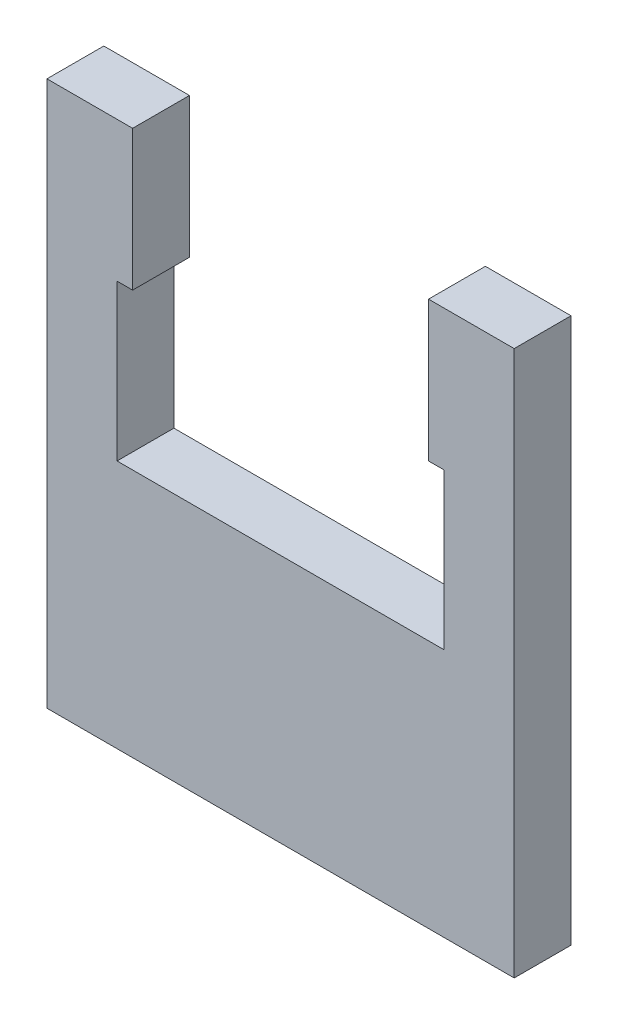
ISO-10303-21;
HEADER;
FILE_DESCRIPTION(('STEP AP214'),'2;1');
FILE_NAME('part.step','',(''),(''),'','','');
FILE_SCHEMA(('AUTOMOTIVE_DESIGN { 1 0 10303 214 1 1 1 1 }'));
ENDSEC;
DATA;
#1=APPLICATION_CONTEXT('core data for automotive mechanical design processes');
#2=APPLICATION_PROTOCOL_DEFINITION('international standard','automotive_design',2000,#1);
#3=PRODUCT_CONTEXT('',#1,'mechanical');
#4=PRODUCT('Part','Part','',(#3));
#5=PRODUCT_RELATED_PRODUCT_CATEGORY('part','',(#4));
#6=PRODUCT_DEFINITION_FORMATION('','',#4);
#7=PRODUCT_DEFINITION_CONTEXT('part definition',#1,'design');
#8=PRODUCT_DEFINITION('design','',#6,#7);
#9=PRODUCT_DEFINITION_SHAPE('','',#8);
#10=(LENGTH_UNIT() NAMED_UNIT(*) SI_UNIT(.MILLI.,.METRE.));
#11=(NAMED_UNIT(*) PLANE_ANGLE_UNIT() SI_UNIT($,.RADIAN.));
#12=(NAMED_UNIT(*) SI_UNIT($,.STERADIAN.) SOLID_ANGLE_UNIT());
#13=UNCERTAINTY_MEASURE_WITH_UNIT(LENGTH_MEASURE(1.E-05),#10,'distance_accuracy_value','');
#14=(GEOMETRIC_REPRESENTATION_CONTEXT(3) GLOBAL_UNCERTAINTY_ASSIGNED_CONTEXT((#13)) GLOBAL_UNIT_ASSIGNED_CONTEXT((#10,
#11,#12)) REPRESENTATION_CONTEXT('',''));
#15=CARTESIAN_POINT('',(0.,0.,0.));
#16=DIRECTION('',(0.,0.,1.));
#17=DIRECTION('',(1.,0.,0.));
#18=AXIS2_PLACEMENT_3D('',#15,#16,#17);
#19=CARTESIAN_POINT('',(-92.1705325405016,0.,9.271));
#20=DIRECTION('',(0.,-1.,0.));
#21=DIRECTION('',(0.,0.,-1.));
#22=AXIS2_PLACEMENT_3D('',#19,#20,#21);
#23=PLANE('',#22);
#24=DIRECTION('',(-1.,0.,0.));
#25=VECTOR('',#24,1.);
#26=CARTESIAN_POINT('',(-92.1705325405016,0.,0.));
#27=LINE('',#26,#25);
#28=CARTESIAN_POINT('',(-78.2005325405016,0.,0.));
#29=VERTEX_POINT('',#28);
#30=CARTESIAN_POINT('',(-92.1705325405016,0.,0.));
#31=VERTEX_POINT('',#30);
#32=EDGE_CURVE('E169',#29,#31,#27,.T.);
#33=ORIENTED_EDGE('',*,*,#32,.T.);
#34=DIRECTION('',(0.,0.,-1.));
#35=VECTOR('',#34,1.);
#36=CARTESIAN_POINT('',(-92.1705325405016,0.,9.271));
#37=LINE('',#36,#35);
#38=CARTESIAN_POINT('',(-92.1705325405016,0.,9.271));
#39=VERTEX_POINT('',#38);
#40=EDGE_CURVE('E11',#39,#31,#37,.T.);
#41=ORIENTED_EDGE('',*,*,#40,.F.);
#42=DIRECTION('',(-1.,0.,0.));
#43=VECTOR('',#42,1.);
#44=CARTESIAN_POINT('',(-92.1705325405016,0.,9.271));
#45=LINE('',#44,#43);
#46=CARTESIAN_POINT('',(-78.2005325405016,0.,9.271));
#47=VERTEX_POINT('',#46);
#48=EDGE_CURVE('E204',#47,#39,#45,.T.);
#49=ORIENTED_EDGE('',*,*,#48,.F.);
#50=DIRECTION('',(0.,0.,-1.));
#51=VECTOR('',#50,1.);
#52=CARTESIAN_POINT('',(-78.2005325405016,0.,9.271));
#53=LINE('',#52,#51);
#54=EDGE_CURVE('E168',#47,#29,#53,.T.);
#55=ORIENTED_EDGE('',*,*,#54,.T.);
#56=EDGE_LOOP('',(#33,#41,#49,#55));
#57=FACE_BOUND('',#56,.T.);
#58=ADVANCED_FACE('F44',(#57),#23,.F.);
#59=CARTESIAN_POINT('',(-92.1705325405016,-88.9,9.271));
#60=DIRECTION('',(1.,0.,0.));
#61=DIRECTION('',(0.,0.,-1.));
#62=AXIS2_PLACEMENT_3D('',#59,#60,#61);
#63=PLANE('',#62);
#64=DIRECTION('',(0.,-1.,0.));
#65=VECTOR('',#64,1.);
#66=CARTESIAN_POINT('',(-92.1705325405016,-88.9,0.));
#67=LINE('',#66,#65);
#68=CARTESIAN_POINT('',(-92.1705325405016,-88.9,0.));
#69=VERTEX_POINT('',#68);
#70=EDGE_CURVE('E174',#31,#69,#67,.T.);
#71=ORIENTED_EDGE('',*,*,#70,.T.);
#72=DIRECTION('',(0.,0.,-1.));
#73=VECTOR('',#72,1.);
#74=CARTESIAN_POINT('',(-92.1705325405016,-88.9,9.271));
#75=LINE('',#74,#73);
#76=CARTESIAN_POINT('',(-92.1705325405016,-88.9,9.271));
#77=VERTEX_POINT('',#76);
#78=EDGE_CURVE('E53',#77,#69,#75,.T.);
#79=ORIENTED_EDGE('',*,*,#78,.F.);
#80=DIRECTION('',(0.,-1.,0.));
#81=VECTOR('',#80,1.);
#82=CARTESIAN_POINT('',(-92.1705325405016,-88.9,9.271));
#83=LINE('',#82,#81);
#84=EDGE_CURVE('E117',#39,#77,#83,.T.);
#85=ORIENTED_EDGE('',*,*,#84,.F.);
#86=ORIENTED_EDGE('',*,*,#40,.T.);
#87=EDGE_LOOP('',(#71,#79,#85,#86));
#88=FACE_BOUND('',#87,.T.);
#89=ADVANCED_FACE('F299',(#88),#63,.F.);
#90=CARTESIAN_POINT('',(-15.9705325405016,-88.9,9.271));
#91=DIRECTION('',(0.,1.,0.));
#92=DIRECTION('',(0.,0.,1.));
#93=AXIS2_PLACEMENT_3D('',#90,#91,#92);
#94=PLANE('',#93);
#95=DIRECTION('',(1.,0.,0.));
#96=VECTOR('',#95,1.);
#97=CARTESIAN_POINT('',(-15.9705325405016,-88.9,0.));
#98=LINE('',#97,#96);
#99=CARTESIAN_POINT('',(-15.9705325405016,-88.9,0.));
#100=VERTEX_POINT('',#99);
#101=EDGE_CURVE('E180',#69,#100,#98,.T.);
#102=ORIENTED_EDGE('',*,*,#101,.T.);
#103=DIRECTION('',(0.,0.,-1.));
#104=VECTOR('',#103,1.);
#105=CARTESIAN_POINT('',(-15.9705325405016,-88.9,9.271));
#106=LINE('',#105,#104);
#107=CARTESIAN_POINT('',(-15.9705325405016,-88.9,9.271));
#108=VERTEX_POINT('',#107);
#109=EDGE_CURVE('E231',#108,#100,#106,.T.);
#110=ORIENTED_EDGE('',*,*,#109,.F.);
#111=DIRECTION('',(1.,0.,0.));
#112=VECTOR('',#111,1.);
#113=CARTESIAN_POINT('',(-15.9705325405016,-88.9,9.271));
#114=LINE('',#113,#112);
#115=EDGE_CURVE('E241',#77,#108,#114,.T.);
#116=ORIENTED_EDGE('',*,*,#115,.F.);
#117=ORIENTED_EDGE('',*,*,#78,.T.);
#118=EDGE_LOOP('',(#102,#110,#116,#117));
#119=FACE_BOUND('',#118,.T.);
#120=ADVANCED_FACE('F236',(#119),#94,.F.);
#121=CARTESIAN_POINT('',(-15.9705325405016,0.,9.271));
#122=DIRECTION('',(-1.,0.,0.));
#123=DIRECTION('',(0.,0.,1.));
#124=AXIS2_PLACEMENT_3D('',#121,#122,#123);
#125=PLANE('',#124);
#126=DIRECTION('',(0.,1.,0.));
#127=VECTOR('',#126,1.);
#128=CARTESIAN_POINT('',(-15.9705325405016,0.,0.));
#129=LINE('',#128,#127);
#130=CARTESIAN_POINT('',(-15.9705325405016,0.,0.));
#131=VERTEX_POINT('',#130);
#132=EDGE_CURVE('E179',#100,#131,#129,.T.);
#133=ORIENTED_EDGE('',*,*,#132,.T.);
#134=DIRECTION('',(0.,0.,-1.));
#135=VECTOR('',#134,1.);
#136=CARTESIAN_POINT('',(-15.9705325405016,0.,9.271));
#137=LINE('',#136,#135);
#138=CARTESIAN_POINT('',(-15.9705325405016,0.,9.271));
#139=VERTEX_POINT('',#138);
#140=EDGE_CURVE('E230',#139,#131,#137,.T.);
#141=ORIENTED_EDGE('',*,*,#140,.F.);
#142=DIRECTION('',(0.,1.,0.));
#143=VECTOR('',#142,1.);
#144=CARTESIAN_POINT('',(-15.9705325405016,0.,9.271));
#145=LINE('',#144,#143);
#146=EDGE_CURVE('E259',#108,#139,#145,.T.);
#147=ORIENTED_EDGE('',*,*,#146,.F.);
#148=ORIENTED_EDGE('',*,*,#109,.T.);
#149=EDGE_LOOP('',(#133,#141,#147,#148));
#150=FACE_BOUND('',#149,.T.);
#151=ADVANCED_FACE('F248',(#150),#125,.F.);
#152=CARTESIAN_POINT('',(-29.9405325405016,0.,9.271));
#153=DIRECTION('',(0.,-1.,0.));
#154=DIRECTION('',(0.,0.,-1.));
#155=AXIS2_PLACEMENT_3D('',#152,#153,#154);
#156=PLANE('',#155);
#157=DIRECTION('',(-1.,0.,0.));
#158=VECTOR('',#157,1.);
#159=CARTESIAN_POINT('',(-29.9405325405016,0.,0.));
#160=LINE('',#159,#158);
#161=CARTESIAN_POINT('',(-29.9405325405016,0.,0.));
#162=VERTEX_POINT('',#161);
#163=EDGE_CURVE('E183',#131,#162,#160,.T.);
#164=ORIENTED_EDGE('',*,*,#163,.T.);
#165=DIRECTION('',(0.,0.,-1.));
#166=VECTOR('',#165,1.);
#167=CARTESIAN_POINT('',(-29.9405325405016,0.,9.271));
#168=LINE('',#167,#166);
#169=CARTESIAN_POINT('',(-29.9405325405016,0.,9.271));
#170=VERTEX_POINT('',#169);
#171=EDGE_CURVE('E223',#170,#162,#168,.T.);
#172=ORIENTED_EDGE('',*,*,#171,.F.);
#173=DIRECTION('',(-1.,0.,0.));
#174=VECTOR('',#173,1.);
#175=CARTESIAN_POINT('',(-29.9405325405016,0.,9.271));
#176=LINE('',#175,#174);
#177=EDGE_CURVE('E258',#139,#170,#176,.T.);
#178=ORIENTED_EDGE('',*,*,#177,.F.);
#179=ORIENTED_EDGE('',*,*,#140,.T.);
#180=EDGE_LOOP('',(#164,#172,#178,#179));
#181=FACE_BOUND('',#180,.T.);
#182=ADVANCED_FACE('F253',(#181),#156,.F.);
#183=CARTESIAN_POINT('',(-29.9405325405016,-22.86,9.271));
#184=DIRECTION('',(1.,0.,0.));
#185=DIRECTION('',(0.,1.,0.));
#186=AXIS2_PLACEMENT_3D('',#183,#184,#185);
#187=PLANE('',#186);
#188=DIRECTION('',(0.,-1.,0.));
#189=VECTOR('',#188,1.);
#190=CARTESIAN_POINT('',(-29.9405325405016,-22.86,0.));
#191=LINE('',#190,#189);
#192=CARTESIAN_POINT('',(-29.9405325405016,-22.86,0.));
#193=VERTEX_POINT('',#192);
#194=EDGE_CURVE('E186',#162,#193,#191,.T.);
#195=ORIENTED_EDGE('',*,*,#194,.T.);
#196=DIRECTION('',(0.,0.,-1.));
#197=VECTOR('',#196,1.);
#198=CARTESIAN_POINT('',(-29.9405325405016,-22.86,9.271));
#199=LINE('',#198,#197);
#200=CARTESIAN_POINT('',(-29.9405325405016,-22.86,9.271));
#201=VERTEX_POINT('',#200);
#202=EDGE_CURVE('E219',#201,#193,#199,.T.);
#203=ORIENTED_EDGE('',*,*,#202,.F.);
#204=DIRECTION('',(0.,-1.,0.));
#205=VECTOR('',#204,1.);
#206=CARTESIAN_POINT('',(-29.9405325405016,-22.86,9.271));
#207=LINE('',#206,#205);
#208=EDGE_CURVE('E260',#170,#201,#207,.T.);
#209=ORIENTED_EDGE('',*,*,#208,.F.);
#210=ORIENTED_EDGE('',*,*,#171,.T.);
#211=EDGE_LOOP('',(#195,#203,#209,#210));
#212=FACE_BOUND('',#211,.T.);
#213=ADVANCED_FACE('F311',(#212),#187,.F.);
#214=CARTESIAN_POINT('',(-27.4005325405016,-22.86,9.271));
#215=DIRECTION('',(0.,1.,0.));
#216=DIRECTION('',(0.,0.,1.));
#217=AXIS2_PLACEMENT_3D('',#214,#215,#216);
#218=PLANE('',#217);
#219=DIRECTION('',(1.,0.,0.));
#220=VECTOR('',#219,1.);
#221=CARTESIAN_POINT('',(-27.4005325405016,-22.86,0.));
#222=LINE('',#221,#220);
#223=CARTESIAN_POINT('',(-27.4005325405016,-22.86,0.));
#224=VERTEX_POINT('',#223);
#225=EDGE_CURVE('E188',#193,#224,#222,.T.);
#226=ORIENTED_EDGE('',*,*,#225,.T.);
#227=DIRECTION('',(0.,0.,-1.));
#228=VECTOR('',#227,1.);
#229=CARTESIAN_POINT('',(-27.4005325405016,-22.86,9.271));
#230=LINE('',#229,#228);
#231=CARTESIAN_POINT('',(-27.4005325405016,-22.86,9.271));
#232=VERTEX_POINT('',#231);
#233=EDGE_CURVE('E214',#232,#224,#230,.T.);
#234=ORIENTED_EDGE('',*,*,#233,.F.);
#235=DIRECTION('',(1.,0.,0.));
#236=VECTOR('',#235,1.);
#237=CARTESIAN_POINT('',(-27.4005325405016,-22.86,9.271));
#238=LINE('',#237,#236);
#239=EDGE_CURVE('E264',#201,#232,#238,.T.);
#240=ORIENTED_EDGE('',*,*,#239,.F.);
#241=ORIENTED_EDGE('',*,*,#202,.T.);
#242=EDGE_LOOP('',(#226,#234,#240,#241));
#243=FACE_BOUND('',#242,.T.);
#244=ADVANCED_FACE('F312',(#243),#218,.F.);
#245=CARTESIAN_POINT('',(-27.4005325405016,-48.26,9.271));
#246=DIRECTION('',(1.,0.,0.));
#247=DIRECTION('',(0.,0.,-1.));
#248=AXIS2_PLACEMENT_3D('',#245,#246,#247);
#249=PLANE('',#248);
#250=DIRECTION('',(0.,-1.,0.));
#251=VECTOR('',#250,1.);
#252=CARTESIAN_POINT('',(-27.4005325405016,-48.26,0.));
#253=LINE('',#252,#251);
#254=CARTESIAN_POINT('',(-27.4005325405016,-48.26,0.));
#255=VERTEX_POINT('',#254);
#256=EDGE_CURVE('E195',#224,#255,#253,.T.);
#257=ORIENTED_EDGE('',*,*,#256,.T.);
#258=DIRECTION('',(0.,0.,-1.));
#259=VECTOR('',#258,1.);
#260=CARTESIAN_POINT('',(-27.4005325405016,-48.26,9.271));
#261=LINE('',#260,#259);
#262=CARTESIAN_POINT('',(-27.4005325405016,-48.26,9.271));
#263=VERTEX_POINT('',#262);
#264=EDGE_CURVE('E213',#263,#255,#261,.T.);
#265=ORIENTED_EDGE('',*,*,#264,.F.);
#266=DIRECTION('',(0.,-1.,0.));
#267=VECTOR('',#266,1.);
#268=CARTESIAN_POINT('',(-27.4005325405016,-48.26,9.271));
#269=LINE('',#268,#267);
#270=EDGE_CURVE('E271',#232,#263,#269,.T.);
#271=ORIENTED_EDGE('',*,*,#270,.F.);
#272=ORIENTED_EDGE('',*,*,#233,.T.);
#273=EDGE_LOOP('',(#257,#265,#271,#272));
#274=FACE_BOUND('',#273,.T.);
#275=ADVANCED_FACE('F278',(#274),#249,.F.);
#276=CARTESIAN_POINT('',(-80.7405325405016,-48.26,9.271));
#277=DIRECTION('',(0.,-1.,0.));
#278=DIRECTION('',(0.,0.,-1.));
#279=AXIS2_PLACEMENT_3D('',#276,#277,#278);
#280=PLANE('',#279);
#281=DIRECTION('',(-1.,0.,0.));
#282=VECTOR('',#281,1.);
#283=CARTESIAN_POINT('',(-80.7405325405016,-48.26,0.));
#284=LINE('',#283,#282);
#285=CARTESIAN_POINT('',(-80.7405325405016,-48.26,0.));
#286=VERTEX_POINT('',#285);
#287=EDGE_CURVE('E193',#255,#286,#284,.T.);
#288=ORIENTED_EDGE('',*,*,#287,.T.);
#289=DIRECTION('',(0.,0.,-1.));
#290=VECTOR('',#289,1.);
#291=CARTESIAN_POINT('',(-80.7405325405016,-48.26,9.271));
#292=LINE('',#291,#290);
#293=CARTESIAN_POINT('',(-80.7405325405016,-48.26,9.271));
#294=VERTEX_POINT('',#293);
#295=EDGE_CURVE('E159',#294,#286,#292,.T.);
#296=ORIENTED_EDGE('',*,*,#295,.F.);
#297=DIRECTION('',(-1.,0.,0.));
#298=VECTOR('',#297,1.);
#299=CARTESIAN_POINT('',(-80.7405325405016,-48.26,9.271));
#300=LINE('',#299,#298);
#301=EDGE_CURVE('E149',#263,#294,#300,.T.);
#302=ORIENTED_EDGE('',*,*,#301,.F.);
#303=ORIENTED_EDGE('',*,*,#264,.T.);
#304=EDGE_LOOP('',(#288,#296,#302,#303));
#305=FACE_BOUND('',#304,.T.);
#306=ADVANCED_FACE('F284',(#305),#280,.F.);
#307=CARTESIAN_POINT('',(-80.7405325405016,-22.86,9.271));
#308=DIRECTION('',(-1.,0.,0.));
#309=DIRECTION('',(0.,0.,1.));
#310=AXIS2_PLACEMENT_3D('',#307,#308,#309);
#311=PLANE('',#310);
#312=DIRECTION('',(0.,1.,0.));
#313=VECTOR('',#312,1.);
#314=CARTESIAN_POINT('',(-80.7405325405016,-22.86,0.));
#315=LINE('',#314,#313);
#316=CARTESIAN_POINT('',(-80.7405325405016,-22.86,0.));
#317=VERTEX_POINT('',#316);
#318=EDGE_CURVE('E160',#286,#317,#315,.T.);
#319=ORIENTED_EDGE('',*,*,#318,.T.);
#320=DIRECTION('',(0.,0.,-1.));
#321=VECTOR('',#320,1.);
#322=CARTESIAN_POINT('',(-80.7405325405016,-22.86,9.271));
#323=LINE('',#322,#321);
#324=CARTESIAN_POINT('',(-80.7405325405016,-22.86,9.271));
#325=VERTEX_POINT('',#324);
#326=EDGE_CURVE('E153',#325,#317,#323,.T.);
#327=ORIENTED_EDGE('',*,*,#326,.F.);
#328=DIRECTION('',(0.,1.,0.));
#329=VECTOR('',#328,1.);
#330=CARTESIAN_POINT('',(-80.7405325405016,-22.86,9.271));
#331=LINE('',#330,#329);
#332=EDGE_CURVE('E145',#294,#325,#331,.T.);
#333=ORIENTED_EDGE('',*,*,#332,.F.);
#334=ORIENTED_EDGE('',*,*,#295,.T.);
#335=EDGE_LOOP('',(#319,#327,#333,#334));
#336=FACE_BOUND('',#335,.T.);
#337=ADVANCED_FACE('F155',(#336),#311,.F.);
#338=CARTESIAN_POINT('',(-78.2005325405016,-22.86,9.271));
#339=DIRECTION('',(0.,1.,0.));
#340=DIRECTION('',(0.,0.,1.));
#341=AXIS2_PLACEMENT_3D('',#338,#339,#340);
#342=PLANE('',#341);
#343=DIRECTION('',(1.,0.,0.));
#344=VECTOR('',#343,1.);
#345=CARTESIAN_POINT('',(-78.2005325405016,-22.86,0.));
#346=LINE('',#345,#344);
#347=CARTESIAN_POINT('',(-78.2005325405016,-22.86,0.));
#348=VERTEX_POINT('',#347);
#349=EDGE_CURVE('E104',#317,#348,#346,.T.);
#350=ORIENTED_EDGE('',*,*,#349,.T.);
#351=DIRECTION('',(0.,0.,-1.));
#352=VECTOR('',#351,1.);
#353=CARTESIAN_POINT('',(-78.2005325405016,-22.86,9.271));
#354=LINE('',#353,#352);
#355=CARTESIAN_POINT('',(-78.2005325405016,-22.86,9.271));
#356=VERTEX_POINT('',#355);
#357=EDGE_CURVE('E158',#356,#348,#354,.T.);
#358=ORIENTED_EDGE('',*,*,#357,.F.);
#359=DIRECTION('',(1.,0.,0.));
#360=VECTOR('',#359,1.);
#361=CARTESIAN_POINT('',(-78.2005325405016,-22.86,9.271));
#362=LINE('',#361,#360);
#363=EDGE_CURVE('E147',#325,#356,#362,.T.);
#364=ORIENTED_EDGE('',*,*,#363,.F.);
#365=ORIENTED_EDGE('',*,*,#326,.T.);
#366=EDGE_LOOP('',(#350,#358,#364,#365));
#367=FACE_BOUND('',#366,.T.);
#368=ADVANCED_FACE('F162',(#367),#342,.F.);
#369=CARTESIAN_POINT('',(-78.2005325405016,0.,9.271));
#370=DIRECTION('',(-1.,0.,0.));
#371=DIRECTION('',(0.,-1.,0.));
#372=AXIS2_PLACEMENT_3D('',#369,#370,#371);
#373=PLANE('',#372);
#374=DIRECTION('',(0.,1.,0.));
#375=VECTOR('',#374,1.);
#376=CARTESIAN_POINT('',(-78.2005325405016,0.,0.));
#377=LINE('',#376,#375);
#378=EDGE_CURVE('E108',#348,#29,#377,.T.);
#379=ORIENTED_EDGE('',*,*,#378,.T.);
#380=ORIENTED_EDGE('',*,*,#54,.F.);
#381=DIRECTION('',(0.,1.,0.));
#382=VECTOR('',#381,1.);
#383=CARTESIAN_POINT('',(-78.2005325405016,0.,9.271));
#384=LINE('',#383,#382);
#385=EDGE_CURVE('E62',#356,#47,#384,.T.);
#386=ORIENTED_EDGE('',*,*,#385,.F.);
#387=ORIENTED_EDGE('',*,*,#357,.T.);
#388=EDGE_LOOP('',(#379,#380,#386,#387));
#389=FACE_BOUND('',#388,.T.);
#390=ADVANCED_FACE('F287',(#389),#373,.F.);
#391=CARTESIAN_POINT('',(0.,0.,9.271));
#392=DIRECTION('',(0.,0.,-1.));
#393=DIRECTION('',(-1.,0.,0.));
#394=AXIS2_PLACEMENT_3D('',#391,#392,#393);
#395=PLANE('',#394);
#396=ORIENTED_EDGE('',*,*,#48,.T.);
#397=ORIENTED_EDGE('',*,*,#84,.T.);
#398=ORIENTED_EDGE('',*,*,#115,.T.);
#399=ORIENTED_EDGE('',*,*,#146,.T.);
#400=ORIENTED_EDGE('',*,*,#177,.T.);
#401=ORIENTED_EDGE('',*,*,#208,.T.);
#402=ORIENTED_EDGE('',*,*,#239,.T.);
#403=ORIENTED_EDGE('',*,*,#270,.T.);
#404=ORIENTED_EDGE('',*,*,#301,.T.);
#405=ORIENTED_EDGE('',*,*,#332,.T.);
#406=ORIENTED_EDGE('',*,*,#363,.T.);
#407=ORIENTED_EDGE('',*,*,#385,.T.);
#408=EDGE_LOOP('',(#396,#397,#398,#399,#400,#401,#402,#403,#404,#405,#406,#407));
#409=FACE_BOUND('',#408,.T.);
#410=ADVANCED_FACE('F143',(#409),#395,.F.);
#411=CARTESIAN_POINT('',(0.,0.,0.));
#412=DIRECTION('',(0.,0.,-1.));
#413=DIRECTION('',(-1.,0.,0.));
#414=AXIS2_PLACEMENT_3D('',#411,#412,#413);
#415=PLANE('',#414);
#416=ORIENTED_EDGE('',*,*,#32,.F.);
#417=ORIENTED_EDGE('',*,*,#378,.F.);
#418=ORIENTED_EDGE('',*,*,#349,.F.);
#419=ORIENTED_EDGE('',*,*,#318,.F.);
#420=ORIENTED_EDGE('',*,*,#287,.F.);
#421=ORIENTED_EDGE('',*,*,#256,.F.);
#422=ORIENTED_EDGE('',*,*,#225,.F.);
#423=ORIENTED_EDGE('',*,*,#194,.F.);
#424=ORIENTED_EDGE('',*,*,#163,.F.);
#425=ORIENTED_EDGE('',*,*,#132,.F.);
#426=ORIENTED_EDGE('',*,*,#101,.F.);
#427=ORIENTED_EDGE('',*,*,#70,.F.);
#428=EDGE_LOOP('',(#416,#417,#418,#419,#420,#421,#422,#423,#424,#425,#426,#427));
#429=FACE_BOUND('',#428,.T.);
#430=ADVANCED_FACE('F245',(#429),#415,.T.);
#431=CLOSED_SHELL('',(#58,#89,#120,#151,#182,#213,#244,#275,#306,#337,#368,#390,#410,#430));
#432=MANIFOLD_SOLID_BREP('B2',#431);
#433=ADVANCED_BREP_SHAPE_REPRESENTATION('',(#18,#432),#14);
#434=SHAPE_DEFINITION_REPRESENTATION(#9,#433);
ENDSEC;
END-ISO-10303-21;
